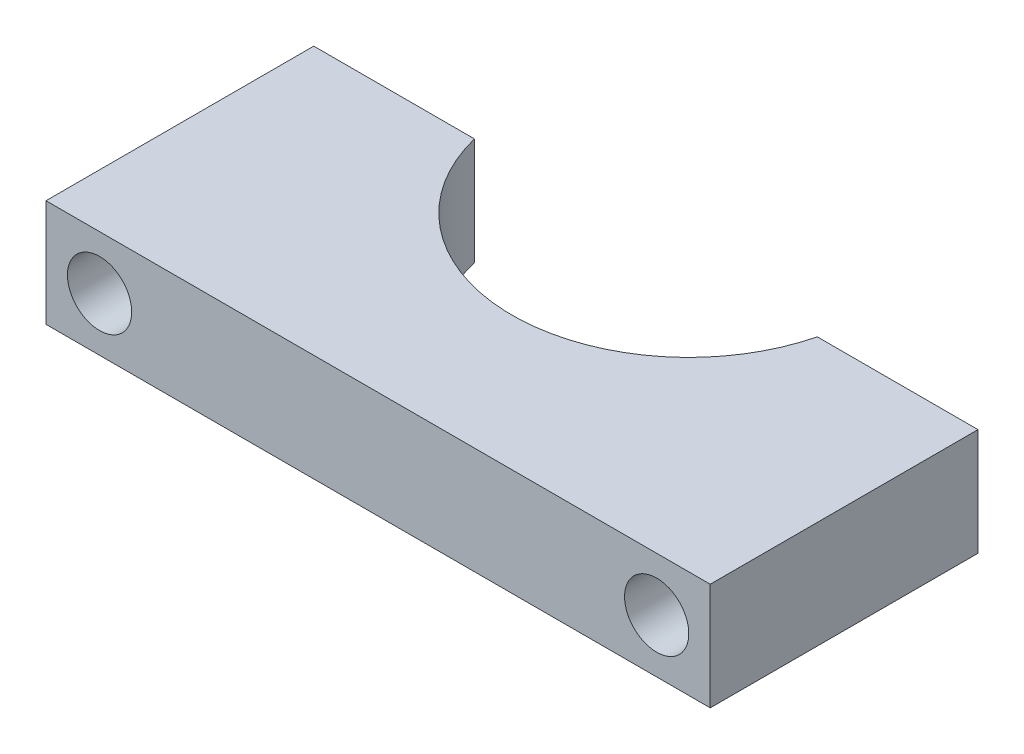
ISO-10303-21;
HEADER;
FILE_DESCRIPTION(('STEP AP214'),'2;1');
FILE_NAME('part.step','',(''),(''),'','','');
FILE_SCHEMA(('AUTOMOTIVE_DESIGN { 1 0 10303 214 1 1 1 1 }'));
ENDSEC;
DATA;
#1=APPLICATION_CONTEXT('core data for automotive mechanical design processes');
#2=APPLICATION_PROTOCOL_DEFINITION('international standard','automotive_design',2000,#1);
#3=PRODUCT_CONTEXT('',#1,'mechanical');
#4=PRODUCT('Part','Part','',(#3));
#5=PRODUCT_RELATED_PRODUCT_CATEGORY('part','',(#4));
#6=PRODUCT_DEFINITION_FORMATION('','',#4);
#7=PRODUCT_DEFINITION_CONTEXT('part definition',#1,'design');
#8=PRODUCT_DEFINITION('design','',#6,#7);
#9=PRODUCT_DEFINITION_SHAPE('','',#8);
#10=(LENGTH_UNIT() NAMED_UNIT(*) SI_UNIT(.MILLI.,.METRE.));
#11=(NAMED_UNIT(*) PLANE_ANGLE_UNIT() SI_UNIT($,.RADIAN.));
#12=(NAMED_UNIT(*) SI_UNIT($,.STERADIAN.) SOLID_ANGLE_UNIT());
#13=UNCERTAINTY_MEASURE_WITH_UNIT(LENGTH_MEASURE(1.E-05),#10,'distance_accuracy_value','');
#14=(GEOMETRIC_REPRESENTATION_CONTEXT(3) GLOBAL_UNCERTAINTY_ASSIGNED_CONTEXT((#13)) GLOBAL_UNIT_ASSIGNED_CONTEXT((#10,
#11,#12)) REPRESENTATION_CONTEXT('',''));
#15=CARTESIAN_POINT('',(0.,0.,0.));
#16=DIRECTION('',(0.,0.,1.));
#17=DIRECTION('',(1.,0.,0.));
#18=AXIS2_PLACEMENT_3D('',#15,#16,#17);
#19=CARTESIAN_POINT('',(31.0078105935821,10.,29.));
#20=DIRECTION('',(0.,0.,-1.));
#21=DIRECTION('',(-1.,0.,0.));
#22=AXIS2_PLACEMENT_3D('',#19,#20,#21);
#23=PLANE('',#22);
#24=CARTESIAN_POINT('',(26.0078105935821,5.,29.));
#25=DIRECTION('',(0.,0.,-1.));
#26=DIRECTION('',(-1.,0.,0.));
#27=AXIS2_PLACEMENT_3D('',#24,#25,#26);
#28=CIRCLE('',#27,3.);
#29=CARTESIAN_POINT('',(23.0078105935821,5.,29.));
#30=VERTEX_POINT('',#29);
#31=EDGE_CURVE('E119',#30,#30,#28,.T.);
#32=ORIENTED_EDGE('',*,*,#31,.T.);
#33=EDGE_LOOP('',(#32));
#34=FACE_BOUND('',#33,.T.);
#35=CARTESIAN_POINT('',(-26.0078105935821,5.,29.));
#36=DIRECTION('',(0.,0.,-1.));
#37=DIRECTION('',(-1.,0.,0.));
#38=AXIS2_PLACEMENT_3D('',#35,#36,#37);
#39=CIRCLE('',#38,3.);
#40=CARTESIAN_POINT('',(-29.0078105935821,5.,29.));
#41=VERTEX_POINT('',#40);
#42=EDGE_CURVE('E147',#41,#41,#39,.T.);
#43=ORIENTED_EDGE('',*,*,#42,.T.);
#44=EDGE_LOOP('',(#43));
#45=FACE_BOUND('',#44,.T.);
#46=DIRECTION('',(1.,0.,0.));
#47=VECTOR('',#46,1.);
#48=CARTESIAN_POINT('',(31.0078105935821,0.,29.));
#49=LINE('',#48,#47);
#50=CARTESIAN_POINT('',(-31.0078105935821,0.,29.));
#51=VERTEX_POINT('',#50);
#52=CARTESIAN_POINT('',(31.0078105935821,0.,29.));
#53=VERTEX_POINT('',#52);
#54=EDGE_CURVE('E79',#51,#53,#49,.T.);
#55=ORIENTED_EDGE('',*,*,#54,.T.);
#56=DIRECTION('',(0.,-1.,0.));
#57=VECTOR('',#56,1.);
#58=CARTESIAN_POINT('',(31.0078105935821,10.,29.));
#59=LINE('',#58,#57);
#60=CARTESIAN_POINT('',(31.0078105935821,10.,29.));
#61=VERTEX_POINT('',#60);
#62=EDGE_CURVE('E11',#61,#53,#59,.T.);
#63=ORIENTED_EDGE('',*,*,#62,.F.);
#64=DIRECTION('',(1.,0.,0.));
#65=VECTOR('',#64,1.);
#66=CARTESIAN_POINT('',(-31.0078105935821,10.,29.));
#67=LINE('',#66,#65);
#68=CARTESIAN_POINT('',(-31.0078105935821,10.,29.));
#69=VERTEX_POINT('',#68);
#70=EDGE_CURVE('E85',#69,#61,#67,.T.);
#71=ORIENTED_EDGE('',*,*,#70,.F.);
#72=DIRECTION('',(0.,-1.,0.));
#73=VECTOR('',#72,1.);
#74=CARTESIAN_POINT('',(-31.0078105935821,10.,29.));
#75=LINE('',#74,#73);
#76=EDGE_CURVE('E113',#69,#51,#75,.T.);
#77=ORIENTED_EDGE('',*,*,#76,.T.);
#78=EDGE_LOOP('',(#55,#63,#71,#77));
#79=FACE_BOUND('',#78,.T.);
#80=ADVANCED_FACE('F33',(#34,#45,#79),#23,.F.);
#81=CARTESIAN_POINT('',(31.0078105935821,10.,3.99999999999999));
#82=DIRECTION('',(-1.,0.,0.));
#83=DIRECTION('',(0.,0.,1.));
#84=AXIS2_PLACEMENT_3D('',#81,#82,#83);
#85=PLANE('',#84);
#86=DIRECTION('',(0.,0.,-1.));
#87=VECTOR('',#86,1.);
#88=CARTESIAN_POINT('',(31.0078105935821,0.,3.99999999999999));
#89=LINE('',#88,#87);
#90=CARTESIAN_POINT('',(31.0078105935821,0.,3.99999999999999));
#91=VERTEX_POINT('',#90);
#92=EDGE_CURVE('E118',#53,#91,#89,.T.);
#93=ORIENTED_EDGE('',*,*,#92,.T.);
#94=DIRECTION('',(0.,-1.,0.));
#95=VECTOR('',#94,1.);
#96=CARTESIAN_POINT('',(31.0078105935821,10.,3.99999999999999));
#97=LINE('',#96,#95);
#98=CARTESIAN_POINT('',(31.0078105935821,10.,3.99999999999999));
#99=VERTEX_POINT('',#98);
#100=EDGE_CURVE('E41',#99,#91,#97,.T.);
#101=ORIENTED_EDGE('',*,*,#100,.F.);
#102=DIRECTION('',(0.,0.,-1.));
#103=VECTOR('',#102,1.);
#104=CARTESIAN_POINT('',(31.0078105935821,10.,3.99999999999999));
#105=LINE('',#104,#103);
#106=EDGE_CURVE('E141',#61,#99,#105,.T.);
#107=ORIENTED_EDGE('',*,*,#106,.F.);
#108=ORIENTED_EDGE('',*,*,#62,.T.);
#109=EDGE_LOOP('',(#93,#101,#107,#108));
#110=FACE_BOUND('',#109,.T.);
#111=ADVANCED_FACE('F161',(#110),#85,.F.);
#112=CARTESIAN_POINT('',(16.0078105935821,10.,3.99999999999999));
#113=DIRECTION('',(0.,0.,1.));
#114=DIRECTION('',(1.,0.,0.));
#115=AXIS2_PLACEMENT_3D('',#112,#113,#114);
#116=PLANE('',#115);
#117=CARTESIAN_POINT('',(26.0078105935821,5.,3.99999999999999));
#118=DIRECTION('',(0.,0.,-1.));
#119=DIRECTION('',(-1.,0.,0.));
#120=AXIS2_PLACEMENT_3D('',#117,#118,#119);
#121=CIRCLE('',#120,3.);
#122=CARTESIAN_POINT('',(23.0078105935821,5.,3.99999999999999));
#123=VERTEX_POINT('',#122);
#124=EDGE_CURVE('E150',#123,#123,#121,.T.);
#125=ORIENTED_EDGE('',*,*,#124,.F.);
#126=EDGE_LOOP('',(#125));
#127=FACE_BOUND('',#126,.T.);
#128=DIRECTION('',(-1.,0.,0.));
#129=VECTOR('',#128,1.);
#130=CARTESIAN_POINT('',(16.0078105935821,0.,3.99999999999999));
#131=LINE('',#130,#129);
#132=CARTESIAN_POINT('',(16.0078105935821,0.,3.99999999999999));
#133=VERTEX_POINT('',#132);
#134=EDGE_CURVE('E121',#91,#133,#131,.T.);
#135=ORIENTED_EDGE('',*,*,#134,.T.);
#136=DIRECTION('',(0.,-1.,0.));
#137=VECTOR('',#136,1.);
#138=CARTESIAN_POINT('',(16.0078105935821,10.,3.99999999999999));
#139=LINE('',#138,#137);
#140=CARTESIAN_POINT('',(16.0078105935821,10.,3.99999999999999));
#141=VERTEX_POINT('',#140);
#142=EDGE_CURVE('E108',#141,#133,#139,.T.);
#143=ORIENTED_EDGE('',*,*,#142,.F.);
#144=DIRECTION('',(-1.,0.,0.));
#145=VECTOR('',#144,1.);
#146=CARTESIAN_POINT('',(16.0078105935821,10.,3.99999999999999));
#147=LINE('',#146,#145);
#148=EDGE_CURVE('E99',#99,#141,#147,.T.);
#149=ORIENTED_EDGE('',*,*,#148,.F.);
#150=ORIENTED_EDGE('',*,*,#100,.T.);
#151=EDGE_LOOP('',(#135,#143,#149,#150));
#152=FACE_BOUND('',#151,.T.);
#153=ADVANCED_FACE('F134',(#127,#152),#116,.F.);
#154=CARTESIAN_POINT('',(0.,10.,0.));
#155=DIRECTION('',(0.,-1.,0.));
#156=DIRECTION('',(0.,0.,-1.));
#157=AXIS2_PLACEMENT_3D('',#154,#155,#156);
#158=CYLINDRICAL_SURFACE('',#157,16.5);
#159=CARTESIAN_POINT('',(0.,0.,0.));
#160=DIRECTION('',(0.,-1.,0.));
#161=DIRECTION('',(0.,0.,1.));
#162=AXIS2_PLACEMENT_3D('',#159,#160,#161);
#163=CIRCLE('',#162,16.5);
#164=CARTESIAN_POINT('',(-16.0078105935821,0.,4.));
#165=VERTEX_POINT('',#164);
#166=EDGE_CURVE('E107',#133,#165,#163,.T.);
#167=ORIENTED_EDGE('',*,*,#166,.T.);
#168=DIRECTION('',(0.,-1.,0.));
#169=VECTOR('',#168,1.);
#170=CARTESIAN_POINT('',(-16.0078105935821,10.,4.));
#171=LINE('',#170,#169);
#172=CARTESIAN_POINT('',(-16.0078105935821,10.,4.));
#173=VERTEX_POINT('',#172);
#174=EDGE_CURVE('E104',#173,#165,#171,.T.);
#175=ORIENTED_EDGE('',*,*,#174,.F.);
#176=CARTESIAN_POINT('',(0.,10.,0.));
#177=DIRECTION('',(0.,-1.,0.));
#178=DIRECTION('',(0.,0.,1.));
#179=AXIS2_PLACEMENT_3D('',#176,#177,#178);
#180=CIRCLE('',#179,16.5);
#181=EDGE_CURVE('E93',#141,#173,#180,.T.);
#182=ORIENTED_EDGE('',*,*,#181,.F.);
#183=ORIENTED_EDGE('',*,*,#142,.T.);
#184=EDGE_LOOP('',(#167,#175,#182,#183));
#185=FACE_BOUND('',#184,.T.);
#186=ADVANCED_FACE('F105',(#185),#158,.F.);
#187=CARTESIAN_POINT('',(-16.0078105935821,10.,4.));
#188=DIRECTION('',(0.,0.,1.));
#189=DIRECTION('',(1.,0.,0.));
#190=AXIS2_PLACEMENT_3D('',#187,#188,#189);
#191=PLANE('',#190);
#192=CARTESIAN_POINT('',(-26.0078105935821,5.,4.));
#193=DIRECTION('',(0.,0.,-1.));
#194=DIRECTION('',(-1.,0.,0.));
#195=AXIS2_PLACEMENT_3D('',#192,#193,#194);
#196=CIRCLE('',#195,3.);
#197=CARTESIAN_POINT('',(-29.0078105935821,5.,4.));
#198=VERTEX_POINT('',#197);
#199=EDGE_CURVE('E151',#198,#198,#196,.T.);
#200=ORIENTED_EDGE('',*,*,#199,.F.);
#201=EDGE_LOOP('',(#200));
#202=FACE_BOUND('',#201,.T.);
#203=DIRECTION('',(-1.,0.,0.));
#204=VECTOR('',#203,1.);
#205=CARTESIAN_POINT('',(-16.0078105935821,0.,4.));
#206=LINE('',#205,#204);
#207=CARTESIAN_POINT('',(-31.0078105935821,0.,4.));
#208=VERTEX_POINT('',#207);
#209=EDGE_CURVE('E72',#165,#208,#206,.T.);
#210=ORIENTED_EDGE('',*,*,#209,.T.);
#211=DIRECTION('',(0.,-1.,0.));
#212=VECTOR('',#211,1.);
#213=CARTESIAN_POINT('',(-31.0078105935821,10.,4.));
#214=LINE('',#213,#212);
#215=CARTESIAN_POINT('',(-31.0078105935821,10.,4.));
#216=VERTEX_POINT('',#215);
#217=EDGE_CURVE('E109',#216,#208,#214,.T.);
#218=ORIENTED_EDGE('',*,*,#217,.F.);
#219=DIRECTION('',(-1.,0.,0.));
#220=VECTOR('',#219,1.);
#221=CARTESIAN_POINT('',(-16.0078105935821,10.,4.));
#222=LINE('',#221,#220);
#223=EDGE_CURVE('E97',#173,#216,#222,.T.);
#224=ORIENTED_EDGE('',*,*,#223,.F.);
#225=ORIENTED_EDGE('',*,*,#174,.T.);
#226=EDGE_LOOP('',(#210,#218,#224,#225));
#227=FACE_BOUND('',#226,.T.);
#228=ADVANCED_FACE('F111',(#202,#227),#191,.F.);
#229=CARTESIAN_POINT('',(-31.0078105935821,10.,4.));
#230=DIRECTION('',(1.,0.,0.));
#231=DIRECTION('',(0.,0.,-1.));
#232=AXIS2_PLACEMENT_3D('',#229,#230,#231);
#233=PLANE('',#232);
#234=DIRECTION('',(0.,0.,1.));
#235=VECTOR('',#234,1.);
#236=CARTESIAN_POINT('',(-31.0078105935821,0.,4.));
#237=LINE('',#236,#235);
#238=EDGE_CURVE('E125',#208,#51,#237,.T.);
#239=ORIENTED_EDGE('',*,*,#238,.T.);
#240=ORIENTED_EDGE('',*,*,#76,.F.);
#241=DIRECTION('',(0.,0.,1.));
#242=VECTOR('',#241,1.);
#243=CARTESIAN_POINT('',(-31.0078105935821,10.,4.));
#244=LINE('',#243,#242);
#245=EDGE_CURVE('E49',#216,#69,#244,.T.);
#246=ORIENTED_EDGE('',*,*,#245,.F.);
#247=ORIENTED_EDGE('',*,*,#217,.T.);
#248=EDGE_LOOP('',(#239,#240,#246,#247));
#249=FACE_BOUND('',#248,.T.);
#250=ADVANCED_FACE('F139',(#249),#233,.F.);
#251=CARTESIAN_POINT('',(0.,10.,0.));
#252=DIRECTION('',(0.,1.,0.));
#253=DIRECTION('',(0.,0.,1.));
#254=AXIS2_PLACEMENT_3D('',#251,#252,#253);
#255=PLANE('',#254);
#256=ORIENTED_EDGE('',*,*,#70,.T.);
#257=ORIENTED_EDGE('',*,*,#106,.T.);
#258=ORIENTED_EDGE('',*,*,#148,.T.);
#259=ORIENTED_EDGE('',*,*,#181,.T.);
#260=ORIENTED_EDGE('',*,*,#223,.T.);
#261=ORIENTED_EDGE('',*,*,#245,.T.);
#262=EDGE_LOOP('',(#256,#257,#258,#259,#260,#261));
#263=FACE_BOUND('',#262,.T.);
#264=ADVANCED_FACE('F95',(#263),#255,.T.);
#265=CARTESIAN_POINT('',(0.,0.,0.));
#266=DIRECTION('',(0.,1.,0.));
#267=DIRECTION('',(0.,0.,1.));
#268=AXIS2_PLACEMENT_3D('',#265,#266,#267);
#269=PLANE('',#268);
#270=ORIENTED_EDGE('',*,*,#54,.F.);
#271=ORIENTED_EDGE('',*,*,#238,.F.);
#272=ORIENTED_EDGE('',*,*,#209,.F.);
#273=ORIENTED_EDGE('',*,*,#166,.F.);
#274=ORIENTED_EDGE('',*,*,#134,.F.);
#275=ORIENTED_EDGE('',*,*,#92,.F.);
#276=EDGE_LOOP('',(#270,#271,#272,#273,#274,#275));
#277=FACE_BOUND('',#276,.T.);
#278=ADVANCED_FACE('F137',(#277),#269,.F.);
#279=CARTESIAN_POINT('',(-26.0078105935821,5.,31.));
#280=DIRECTION('',(0.,0.,-1.));
#281=DIRECTION('',(-1.,0.,0.));
#282=AXIS2_PLACEMENT_3D('',#279,#280,#281);
#283=CYLINDRICAL_SURFACE('',#282,3.);
#284=ORIENTED_EDGE('',*,*,#199,.T.);
#285=EDGE_LOOP('',(#284));
#286=FACE_BOUND('',#285,.T.);
#287=ORIENTED_EDGE('',*,*,#42,.F.);
#288=EDGE_LOOP('',(#287));
#289=FACE_BOUND('',#288,.T.);
#290=ADVANCED_FACE('F176',(#286,#289),#283,.F.);
#291=CARTESIAN_POINT('',(26.0078105935821,5.,31.));
#292=DIRECTION('',(0.,0.,-1.));
#293=DIRECTION('',(-1.,0.,0.));
#294=AXIS2_PLACEMENT_3D('',#291,#292,#293);
#295=CYLINDRICAL_SURFACE('',#294,3.);
#296=ORIENTED_EDGE('',*,*,#124,.T.);
#297=EDGE_LOOP('',(#296));
#298=FACE_BOUND('',#297,.T.);
#299=ORIENTED_EDGE('',*,*,#31,.F.);
#300=EDGE_LOOP('',(#299));
#301=FACE_BOUND('',#300,.T.);
#302=ADVANCED_FACE('F157',(#298,#301),#295,.F.);
#303=CLOSED_SHELL('',(#80,#111,#153,#186,#228,#250,#264,#278,#290,#302));
#304=MANIFOLD_SOLID_BREP('B2',#303);
#305=ADVANCED_BREP_SHAPE_REPRESENTATION('',(#18,#304),#14);
#306=SHAPE_DEFINITION_REPRESENTATION(#9,#305);
ENDSEC;
END-ISO-10303-21;
